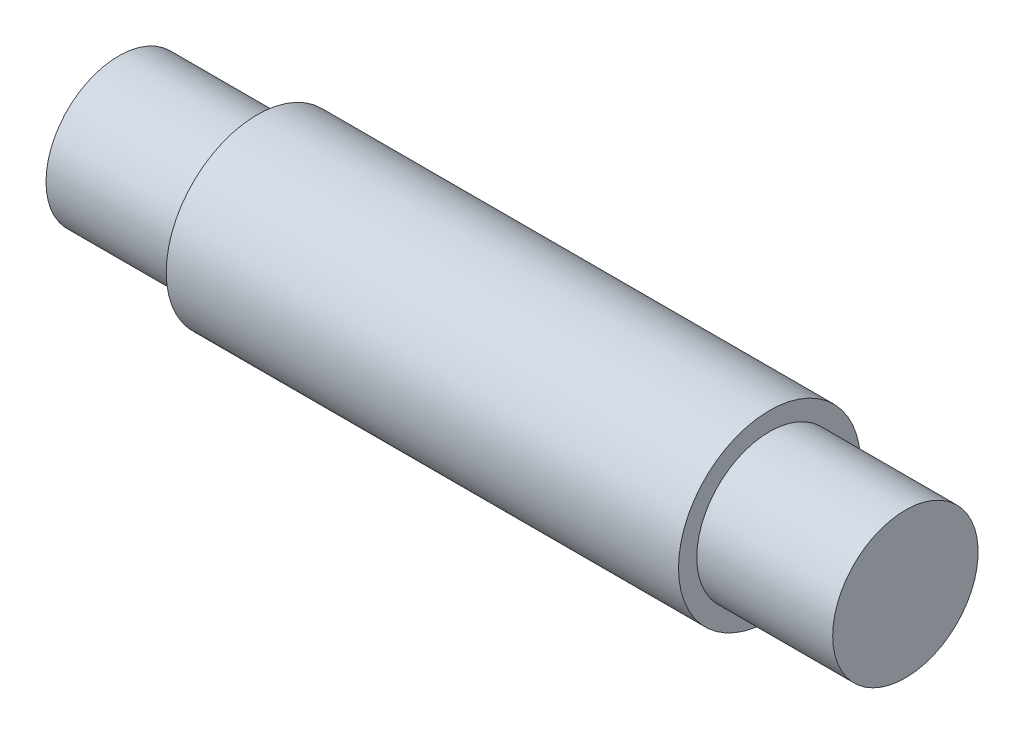
ISO-10303-21;
HEADER;
FILE_DESCRIPTION(('STEP AP214'),'2;1');
FILE_NAME('part.step','',(''),(''),'','','');
FILE_SCHEMA(('AUTOMOTIVE_DESIGN { 1 0 10303 214 1 1 1 1 }'));
ENDSEC;
DATA;
#1=APPLICATION_CONTEXT('core data for automotive mechanical design processes');
#2=APPLICATION_PROTOCOL_DEFINITION('international standard','automotive_design',2000,#1);
#3=PRODUCT_CONTEXT('',#1,'mechanical');
#4=PRODUCT('Part','Part','',(#3));
#5=PRODUCT_RELATED_PRODUCT_CATEGORY('part','',(#4));
#6=PRODUCT_DEFINITION_FORMATION('','',#4);
#7=PRODUCT_DEFINITION_CONTEXT('part definition',#1,'design');
#8=PRODUCT_DEFINITION('design','',#6,#7);
#9=PRODUCT_DEFINITION_SHAPE('','',#8);
#10=(LENGTH_UNIT() NAMED_UNIT(*) SI_UNIT(.MILLI.,.METRE.));
#11=(NAMED_UNIT(*) PLANE_ANGLE_UNIT() SI_UNIT($,.RADIAN.));
#12=(NAMED_UNIT(*) SI_UNIT($,.STERADIAN.) SOLID_ANGLE_UNIT());
#13=UNCERTAINTY_MEASURE_WITH_UNIT(LENGTH_MEASURE(1.E-05),#10,'distance_accuracy_value','');
#14=(GEOMETRIC_REPRESENTATION_CONTEXT(3) GLOBAL_UNCERTAINTY_ASSIGNED_CONTEXT((#13)) GLOBAL_UNIT_ASSIGNED_CONTEXT((#10,
#11,#12)) REPRESENTATION_CONTEXT('',''));
#15=CARTESIAN_POINT('',(0.,0.,0.));
#16=DIRECTION('',(0.,0.,1.));
#17=DIRECTION('',(1.,0.,0.));
#18=AXIS2_PLACEMENT_3D('',#15,#16,#17);
#19=CARTESIAN_POINT('',(-43.,7.95,0.));
#20=DIRECTION('',(1.,0.,0.));
#21=DIRECTION('',(0.,0.,-1.));
#22=AXIS2_PLACEMENT_3D('',#19,#20,#21);
#23=PLANE('',#22);
#24=CARTESIAN_POINT('',(-43.,0.,0.));
#25=DIRECTION('',(-1.,0.,0.));
#26=DIRECTION('',(0.,0.,1.));
#27=AXIS2_PLACEMENT_3D('',#24,#25,#26);
#28=CIRCLE('',#27,7.95);
#29=CARTESIAN_POINT('',(-43.,0.,7.95));
#30=VERTEX_POINT('',#29);
#31=EDGE_CURVE('E10',#30,#30,#28,.T.);
#32=ORIENTED_EDGE('',*,*,#31,.T.);
#33=EDGE_LOOP('',(#32));
#34=FACE_BOUND('',#33,.T.);
#35=ADVANCED_FACE('F37',(#34),#23,.F.);
#36=CARTESIAN_POINT('',(-43.,0.,0.));
#37=DIRECTION('',(-1.,0.,0.));
#38=DIRECTION('',(0.,0.,1.));
#39=AXIS2_PLACEMENT_3D('',#36,#37,#38);
#40=CYLINDRICAL_SURFACE('',#39,7.95);
#41=ORIENTED_EDGE('',*,*,#31,.F.);
#42=EDGE_LOOP('',(#41));
#43=FACE_BOUND('',#42,.T.);
#44=CARTESIAN_POINT('',(-27.8577878103837,0.,0.));
#45=DIRECTION('',(-1.,0.,0.));
#46=DIRECTION('',(0.,0.,1.));
#47=AXIS2_PLACEMENT_3D('',#44,#45,#46);
#48=CIRCLE('',#47,7.95);
#49=CARTESIAN_POINT('',(-27.8577878103837,0.,7.95));
#50=VERTEX_POINT('',#49);
#51=EDGE_CURVE('E43',#50,#50,#48,.T.);
#52=ORIENTED_EDGE('',*,*,#51,.T.);
#53=EDGE_LOOP('',(#52));
#54=FACE_BOUND('',#53,.T.);
#55=ADVANCED_FACE('F75',(#43,#54),#40,.T.);
#56=CARTESIAN_POINT('',(-27.8577878103837,7.95,0.));
#57=DIRECTION('',(1.,0.,0.));
#58=DIRECTION('',(0.,0.,-1.));
#59=AXIS2_PLACEMENT_3D('',#56,#57,#58);
#60=PLANE('',#59);
#61=ORIENTED_EDGE('',*,*,#51,.F.);
#62=EDGE_LOOP('',(#61));
#63=FACE_BOUND('',#62,.T.);
#64=CARTESIAN_POINT('',(-27.8577878103837,0.,0.));
#65=DIRECTION('',(-1.,0.,0.));
#66=DIRECTION('',(0.,0.,1.));
#67=AXIS2_PLACEMENT_3D('',#64,#65,#66);
#68=CIRCLE('',#67,9.95);
#69=CARTESIAN_POINT('',(-27.8577878103837,0.,9.95));
#70=VERTEX_POINT('',#69);
#71=EDGE_CURVE('E47',#70,#70,#68,.T.);
#72=ORIENTED_EDGE('',*,*,#71,.T.);
#73=EDGE_LOOP('',(#72));
#74=FACE_BOUND('',#73,.T.);
#75=ADVANCED_FACE('F79',(#63,#74),#60,.F.);
#76=CARTESIAN_POINT('',(-43.,0.,0.));
#77=DIRECTION('',(-1.,0.,0.));
#78=DIRECTION('',(0.,0.,1.));
#79=AXIS2_PLACEMENT_3D('',#76,#77,#78);
#80=CYLINDRICAL_SURFACE('',#79,9.95);
#81=ORIENTED_EDGE('',*,*,#71,.F.);
#82=EDGE_LOOP('',(#81));
#83=FACE_BOUND('',#82,.T.);
#84=CARTESIAN_POINT('',(28.1422121896163,0.,0.));
#85=DIRECTION('',(-1.,0.,0.));
#86=DIRECTION('',(0.,0.,1.));
#87=AXIS2_PLACEMENT_3D('',#84,#85,#86);
#88=CIRCLE('',#87,9.95);
#89=CARTESIAN_POINT('',(28.1422121896163,0.,9.95));
#90=VERTEX_POINT('',#89);
#91=EDGE_CURVE('E51',#90,#90,#88,.T.);
#92=ORIENTED_EDGE('',*,*,#91,.T.);
#93=EDGE_LOOP('',(#92));
#94=FACE_BOUND('',#93,.T.);
#95=ADVANCED_FACE('F84',(#83,#94),#80,.T.);
#96=CARTESIAN_POINT('',(28.1422121896163,9.95,0.));
#97=DIRECTION('',(-1.,0.,0.));
#98=DIRECTION('',(0.,0.,1.));
#99=AXIS2_PLACEMENT_3D('',#96,#97,#98);
#100=PLANE('',#99);
#101=ORIENTED_EDGE('',*,*,#91,.F.);
#102=EDGE_LOOP('',(#101));
#103=FACE_BOUND('',#102,.T.);
#104=CARTESIAN_POINT('',(28.1422121896163,0.,0.));
#105=DIRECTION('',(-1.,0.,0.));
#106=DIRECTION('',(0.,0.,1.));
#107=AXIS2_PLACEMENT_3D('',#104,#105,#106);
#108=CIRCLE('',#107,7.95);
#109=CARTESIAN_POINT('',(28.1422121896163,0.,7.95));
#110=VERTEX_POINT('',#109);
#111=EDGE_CURVE('E56',#110,#110,#108,.T.);
#112=ORIENTED_EDGE('',*,*,#111,.T.);
#113=EDGE_LOOP('',(#112));
#114=FACE_BOUND('',#113,.T.);
#115=ADVANCED_FACE('F71',(#103,#114),#100,.F.);
#116=CARTESIAN_POINT('',(-43.,0.,0.));
#117=DIRECTION('',(-1.,0.,0.));
#118=DIRECTION('',(0.,0.,1.));
#119=AXIS2_PLACEMENT_3D('',#116,#117,#118);
#120=CYLINDRICAL_SURFACE('',#119,7.95);
#121=ORIENTED_EDGE('',*,*,#111,.F.);
#122=EDGE_LOOP('',(#121));
#123=FACE_BOUND('',#122,.T.);
#124=CARTESIAN_POINT('',(43.,0.,0.));
#125=DIRECTION('',(-1.,0.,0.));
#126=DIRECTION('',(0.,0.,1.));
#127=AXIS2_PLACEMENT_3D('',#124,#125,#126);
#128=CIRCLE('',#127,7.95);
#129=CARTESIAN_POINT('',(43.,0.,7.95));
#130=VERTEX_POINT('',#129);
#131=EDGE_CURVE('E59',#130,#130,#128,.T.);
#132=ORIENTED_EDGE('',*,*,#131,.T.);
#133=EDGE_LOOP('',(#132));
#134=FACE_BOUND('',#133,.T.);
#135=ADVANCED_FACE('F63',(#123,#134),#120,.T.);
#136=CARTESIAN_POINT('',(43.,7.95,0.));
#137=DIRECTION('',(-1.,0.,0.));
#138=DIRECTION('',(0.,0.,1.));
#139=AXIS2_PLACEMENT_3D('',#136,#137,#138);
#140=PLANE('',#139);
#141=ORIENTED_EDGE('',*,*,#131,.F.);
#142=EDGE_LOOP('',(#141));
#143=FACE_BOUND('',#142,.T.);
#144=ADVANCED_FACE('F65',(#143),#140,.F.);
#145=CLOSED_SHELL('',(#35,#55,#75,#95,#115,#135,#144));
#146=MANIFOLD_SOLID_BREP('B2',#145);
#147=ADVANCED_BREP_SHAPE_REPRESENTATION('',(#18,#146),#14);
#148=SHAPE_DEFINITION_REPRESENTATION(#9,#147);
ENDSEC;
END-ISO-10303-21;
